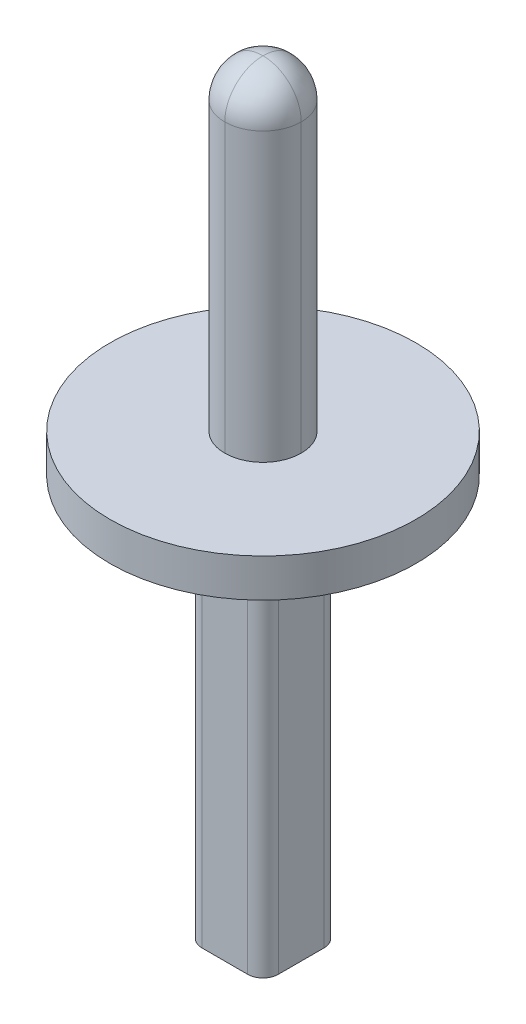
ISO-10303-21;
HEADER;
FILE_DESCRIPTION(('STEP AP214'),'2;1');
FILE_NAME('part.step','',(''),(''),'','','');
FILE_SCHEMA(('AUTOMOTIVE_DESIGN { 1 0 10303 214 1 1 1 1 }'));
ENDSEC;
DATA;
#1=APPLICATION_CONTEXT('core data for automotive mechanical design processes');
#2=APPLICATION_PROTOCOL_DEFINITION('international standard','automotive_design',2000,#1);
#3=PRODUCT_CONTEXT('',#1,'mechanical');
#4=PRODUCT('Part','Part','',(#3));
#5=PRODUCT_RELATED_PRODUCT_CATEGORY('part','',(#4));
#6=PRODUCT_DEFINITION_FORMATION('','',#4);
#7=PRODUCT_DEFINITION_CONTEXT('part definition',#1,'design');
#8=PRODUCT_DEFINITION('design','',#6,#7);
#9=PRODUCT_DEFINITION_SHAPE('','',#8);
#10=(LENGTH_UNIT() NAMED_UNIT(*) SI_UNIT(.MILLI.,.METRE.));
#11=(NAMED_UNIT(*) PLANE_ANGLE_UNIT() SI_UNIT($,.RADIAN.));
#12=(NAMED_UNIT(*) SI_UNIT($,.STERADIAN.) SOLID_ANGLE_UNIT());
#13=UNCERTAINTY_MEASURE_WITH_UNIT(LENGTH_MEASURE(1.E-05),#10,'distance_accuracy_value','');
#14=(GEOMETRIC_REPRESENTATION_CONTEXT(3) GLOBAL_UNCERTAINTY_ASSIGNED_CONTEXT((#13)) GLOBAL_UNIT_ASSIGNED_CONTEXT((#10,
#11,#12)) REPRESENTATION_CONTEXT('',''));
#15=CARTESIAN_POINT('',(0.,0.,0.));
#16=DIRECTION('',(0.,0.,1.));
#17=DIRECTION('',(1.,0.,0.));
#18=AXIS2_PLACEMENT_3D('',#15,#16,#17);
#19=CARTESIAN_POINT('',(0.,11.2295943431093,0.));
#20=DIRECTION('',(0.,1.,0.));
#21=DIRECTION('',(0.,0.,1.));
#22=AXIS2_PLACEMENT_3D('',#19,#20,#21);
#23=PLANE('',#22);
#24=CARTESIAN_POINT('',(0.,11.2295943431093,0.));
#25=DIRECTION('',(0.,1.,0.));
#26=DIRECTION('',(0.,0.,1.));
#27=AXIS2_PLACEMENT_3D('',#24,#25,#26);
#28=CIRCLE('',#27,7.5);
#29=CARTESIAN_POINT('',(-7.5,11.2295943431093,0.));
#30=VERTEX_POINT('',#29);
#31=CARTESIAN_POINT('',(0.,11.2295943431093,-7.5));
#32=VERTEX_POINT('',#31);
#33=EDGE_CURVE('E182',#30,#32,#28,.F.);
#34=ORIENTED_EDGE('',*,*,#33,.T.);
#35=CARTESIAN_POINT('',(0.,11.2295943431093,0.));
#36=DIRECTION('',(0.,1.,0.));
#37=DIRECTION('',(0.,0.,1.));
#38=AXIS2_PLACEMENT_3D('',#35,#36,#37);
#39=CIRCLE('',#38,7.5);
#40=CARTESIAN_POINT('',(7.5,11.2295943431093,0.));
#41=VERTEX_POINT('',#40);
#42=EDGE_CURVE('E166',#32,#41,#39,.F.);
#43=ORIENTED_EDGE('',*,*,#42,.T.);
#44=CARTESIAN_POINT('',(0.,11.2295943431093,0.));
#45=DIRECTION('',(0.,1.,0.));
#46=DIRECTION('',(0.,0.,1.));
#47=AXIS2_PLACEMENT_3D('',#44,#45,#46);
#48=CIRCLE('',#47,7.5);
#49=CARTESIAN_POINT('',(0.,11.2295943431093,7.5));
#50=VERTEX_POINT('',#49);
#51=EDGE_CURVE('E178',#41,#50,#48,.F.);
#52=ORIENTED_EDGE('',*,*,#51,.T.);
#53=CARTESIAN_POINT('',(0.,11.2295943431093,0.));
#54=DIRECTION('',(0.,1.,0.));
#55=DIRECTION('',(0.,0.,1.));
#56=AXIS2_PLACEMENT_3D('',#53,#54,#55);
#57=CIRCLE('',#56,7.5);
#58=EDGE_CURVE('E180',#50,#30,#57,.F.);
#59=ORIENTED_EDGE('',*,*,#58,.T.);
#60=EDGE_LOOP('',(#34,#43,#52,#59));
#61=FACE_BOUND('',#60,.T.);
#62=CARTESIAN_POINT('',(0.,11.2295943431093,0.));
#63=DIRECTION('',(0.,1.,0.));
#64=DIRECTION('',(0.,0.,1.));
#65=AXIS2_PLACEMENT_3D('',#62,#63,#64);
#66=CIRCLE('',#65,30.);
#67=CARTESIAN_POINT('',(0.,11.2295943431093,30.));
#68=VERTEX_POINT('',#67);
#69=EDGE_CURVE('E232',#68,#68,#66,.T.);
#70=ORIENTED_EDGE('',*,*,#69,.T.);
#71=EDGE_LOOP('',(#70));
#72=FACE_BOUND('',#71,.T.);
#73=ADVANCED_FACE('F45',(#61,#72),#23,.T.);
#74=CARTESIAN_POINT('',(0.,3.72959434310934,0.));
#75=DIRECTION('',(0.,1.,0.));
#76=DIRECTION('',(0.,0.,1.));
#77=AXIS2_PLACEMENT_3D('',#74,#75,#76);
#78=PLANE('',#77);
#79=CARTESIAN_POINT('',(0.,3.72959434310934,0.));
#80=DIRECTION('',(0.,1.,0.));
#81=DIRECTION('',(0.,0.,1.));
#82=AXIS2_PLACEMENT_3D('',#79,#80,#81);
#83=CIRCLE('',#82,30.);
#84=CARTESIAN_POINT('',(0.,3.72959434310934,30.));
#85=VERTEX_POINT('',#84);
#86=EDGE_CURVE('E233',#85,#85,#83,.T.);
#87=ORIENTED_EDGE('',*,*,#86,.F.);
#88=EDGE_LOOP('',(#87));
#89=FACE_BOUND('',#88,.T.);
#90=DIRECTION('',(-1.,0.,0.));
#91=VECTOR('',#90,1.);
#92=CARTESIAN_POINT('',(-7.5,3.72959434310934,-7.5));
#93=LINE('',#92,#91);
#94=CARTESIAN_POINT('',(4.5,3.72959434310934,-7.5));
#95=VERTEX_POINT('',#94);
#96=CARTESIAN_POINT('',(-4.5,3.72959434310934,-7.5));
#97=VERTEX_POINT('',#96);
#98=EDGE_CURVE('E236',#95,#97,#93,.T.);
#99=ORIENTED_EDGE('',*,*,#98,.T.);
#100=CARTESIAN_POINT('',(-4.5,3.72959434310933,-4.5));
#101=DIRECTION('',(0.,1.,0.));
#102=DIRECTION('',(0.,0.,1.));
#103=AXIS2_PLACEMENT_3D('',#100,#101,#102);
#104=CIRCLE('',#103,3.);
#105=CARTESIAN_POINT('',(-7.5,3.72959434310934,-4.5));
#106=VERTEX_POINT('',#105);
#107=EDGE_CURVE('E134',#97,#106,#104,.T.);
#108=ORIENTED_EDGE('',*,*,#107,.T.);
#109=DIRECTION('',(0.,0.,1.));
#110=VECTOR('',#109,1.);
#111=CARTESIAN_POINT('',(-7.5,3.72959434310934,-7.5));
#112=LINE('',#111,#110);
#113=CARTESIAN_POINT('',(-7.5,3.72959434310934,4.5));
#114=VERTEX_POINT('',#113);
#115=EDGE_CURVE('E169',#106,#114,#112,.T.);
#116=ORIENTED_EDGE('',*,*,#115,.T.);
#117=CARTESIAN_POINT('',(-4.5,3.72959434310933,4.5));
#118=DIRECTION('',(0.,1.,0.));
#119=DIRECTION('',(0.,0.,1.));
#120=AXIS2_PLACEMENT_3D('',#117,#118,#119);
#121=CIRCLE('',#120,3.);
#122=CARTESIAN_POINT('',(-4.5,3.72959434310934,7.5));
#123=VERTEX_POINT('',#122);
#124=EDGE_CURVE('E187',#114,#123,#121,.T.);
#125=ORIENTED_EDGE('',*,*,#124,.T.);
#126=DIRECTION('',(1.,0.,0.));
#127=VECTOR('',#126,1.);
#128=CARTESIAN_POINT('',(-7.5,3.72959434310934,7.5));
#129=LINE('',#128,#127);
#130=CARTESIAN_POINT('',(4.5,3.72959434310934,7.5));
#131=VERTEX_POINT('',#130);
#132=EDGE_CURVE('E243',#123,#131,#129,.T.);
#133=ORIENTED_EDGE('',*,*,#132,.T.);
#134=CARTESIAN_POINT('',(4.5,3.72959434310933,4.5));
#135=DIRECTION('',(0.,1.,0.));
#136=DIRECTION('',(0.,0.,1.));
#137=AXIS2_PLACEMENT_3D('',#134,#135,#136);
#138=CIRCLE('',#137,3.);
#139=CARTESIAN_POINT('',(7.5,3.72959434310934,4.5));
#140=VERTEX_POINT('',#139);
#141=EDGE_CURVE('E185',#131,#140,#138,.T.);
#142=ORIENTED_EDGE('',*,*,#141,.T.);
#143=DIRECTION('',(0.,0.,-1.));
#144=VECTOR('',#143,1.);
#145=CARTESIAN_POINT('',(7.5,3.72959434310934,-7.5));
#146=LINE('',#145,#144);
#147=CARTESIAN_POINT('',(7.5,3.72959434310934,-4.5));
#148=VERTEX_POINT('',#147);
#149=EDGE_CURVE('E240',#140,#148,#146,.T.);
#150=ORIENTED_EDGE('',*,*,#149,.T.);
#151=CARTESIAN_POINT('',(4.5,3.72959434310933,-4.5));
#152=DIRECTION('',(0.,1.,0.));
#153=DIRECTION('',(0.,0.,1.));
#154=AXIS2_PLACEMENT_3D('',#151,#152,#153);
#155=CIRCLE('',#154,3.);
#156=EDGE_CURVE('E189',#148,#95,#155,.T.);
#157=ORIENTED_EDGE('',*,*,#156,.T.);
#158=EDGE_LOOP('',(#99,#108,#116,#125,#133,#142,#150,#157));
#159=FACE_BOUND('',#158,.T.);
#160=ADVANCED_FACE('F247',(#89,#159),#78,.F.);
#161=CARTESIAN_POINT('',(0.,11.2295943431093,0.));
#162=DIRECTION('',(0.,-1.,0.));
#163=DIRECTION('',(0.,0.,-1.));
#164=AXIS2_PLACEMENT_3D('',#161,#162,#163);
#165=CYLINDRICAL_SURFACE('',#164,30.);
#166=ORIENTED_EDGE('',*,*,#69,.F.);
#167=EDGE_LOOP('',(#166));
#168=FACE_BOUND('',#167,.T.);
#169=ORIENTED_EDGE('',*,*,#86,.T.);
#170=EDGE_LOOP('',(#169));
#171=FACE_BOUND('',#170,.T.);
#172=ADVANCED_FACE('F297',(#168,#171),#165,.T.);
#173=CARTESIAN_POINT('',(0.,-75.0204056568907,0.));
#174=DIRECTION('',(0.,-1.,0.));
#175=DIRECTION('',(0.,0.,-1.));
#176=AXIS2_PLACEMENT_3D('',#173,#174,#175);
#177=PLANE('',#176);
#178=DIRECTION('',(0.,0.,1.));
#179=VECTOR('',#178,1.);
#180=CARTESIAN_POINT('',(-7.5,-75.0204056568907,7.5));
#181=LINE('',#180,#179);
#182=CARTESIAN_POINT('',(-7.5,-75.0204056568907,-4.5));
#183=VERTEX_POINT('',#182);
#184=CARTESIAN_POINT('',(-7.5,-75.0204056568907,4.5));
#185=VERTEX_POINT('',#184);
#186=EDGE_CURVE('E223',#183,#185,#181,.T.);
#187=ORIENTED_EDGE('',*,*,#186,.F.);
#188=CARTESIAN_POINT('',(-4.5,-75.0204056568907,-4.5));
#189=DIRECTION('',(0.,-1.,0.));
#190=DIRECTION('',(0.,0.,-1.));
#191=AXIS2_PLACEMENT_3D('',#188,#189,#190);
#192=CIRCLE('',#191,3.);
#193=CARTESIAN_POINT('',(-4.5,-75.0204056568907,-7.5));
#194=VERTEX_POINT('',#193);
#195=EDGE_CURVE('E207',#183,#194,#192,.T.);
#196=ORIENTED_EDGE('',*,*,#195,.T.);
#197=DIRECTION('',(-1.,0.,0.));
#198=VECTOR('',#197,1.);
#199=CARTESIAN_POINT('',(-7.5,-75.0204056568907,-7.5));
#200=LINE('',#199,#198);
#201=CARTESIAN_POINT('',(4.5,-75.0204056568907,-7.5));
#202=VERTEX_POINT('',#201);
#203=EDGE_CURVE('E226',#202,#194,#200,.T.);
#204=ORIENTED_EDGE('',*,*,#203,.F.);
#205=CARTESIAN_POINT('',(4.5,-75.0204056568907,-4.5));
#206=DIRECTION('',(0.,-1.,0.));
#207=DIRECTION('',(0.,0.,-1.));
#208=AXIS2_PLACEMENT_3D('',#205,#206,#207);
#209=CIRCLE('',#208,3.);
#210=CARTESIAN_POINT('',(7.5,-75.0204056568907,-4.5));
#211=VERTEX_POINT('',#210);
#212=EDGE_CURVE('E209',#202,#211,#209,.T.);
#213=ORIENTED_EDGE('',*,*,#212,.T.);
#214=DIRECTION('',(0.,0.,-1.));
#215=VECTOR('',#214,1.);
#216=CARTESIAN_POINT('',(7.5,-75.0204056568907,7.5));
#217=LINE('',#216,#215);
#218=CARTESIAN_POINT('',(7.5,-75.0204056568907,4.5));
#219=VERTEX_POINT('',#218);
#220=EDGE_CURVE('E229',#219,#211,#217,.T.);
#221=ORIENTED_EDGE('',*,*,#220,.F.);
#222=CARTESIAN_POINT('',(4.5,-75.0204056568907,4.5));
#223=DIRECTION('',(0.,-1.,0.));
#224=DIRECTION('',(0.,0.,-1.));
#225=AXIS2_PLACEMENT_3D('',#222,#223,#224);
#226=CIRCLE('',#225,3.);
#227=CARTESIAN_POINT('',(4.5,-75.0204056568907,7.5));
#228=VERTEX_POINT('',#227);
#229=EDGE_CURVE('E213',#219,#228,#226,.T.);
#230=ORIENTED_EDGE('',*,*,#229,.T.);
#231=DIRECTION('',(1.,0.,0.));
#232=VECTOR('',#231,1.);
#233=CARTESIAN_POINT('',(-7.5,-75.0204056568907,7.5));
#234=LINE('',#233,#232);
#235=CARTESIAN_POINT('',(-4.5,-75.0204056568907,7.5));
#236=VERTEX_POINT('',#235);
#237=EDGE_CURVE('E220',#236,#228,#234,.T.);
#238=ORIENTED_EDGE('',*,*,#237,.F.);
#239=CARTESIAN_POINT('',(-4.5,-75.0204056568907,4.5));
#240=DIRECTION('',(0.,-1.,0.));
#241=DIRECTION('',(0.,0.,-1.));
#242=AXIS2_PLACEMENT_3D('',#239,#240,#241);
#243=CIRCLE('',#242,3.);
#244=EDGE_CURVE('E211',#236,#185,#243,.T.);
#245=ORIENTED_EDGE('',*,*,#244,.T.);
#246=EDGE_LOOP('',(#187,#196,#204,#213,#221,#230,#238,#245));
#247=FACE_BOUND('',#246,.T.);
#248=ADVANCED_FACE('F261',(#247),#177,.T.);
#249=CARTESIAN_POINT('',(-7.5,74.9795943431093,7.5));
#250=DIRECTION('',(0.,0.,-1.));
#251=DIRECTION('',(-1.,0.,0.));
#252=AXIS2_PLACEMENT_3D('',#249,#250,#251);
#253=PLANE('',#252);
#254=ORIENTED_EDGE('',*,*,#132,.F.);
#255=DIRECTION('',(0.,-1.,0.));
#256=VECTOR('',#255,1.);
#257=CARTESIAN_POINT('',(-4.5,74.9795943431093,7.5));
#258=LINE('',#257,#256);
#259=EDGE_CURVE('E192',#123,#236,#258,.T.);
#260=ORIENTED_EDGE('',*,*,#259,.T.);
#261=ORIENTED_EDGE('',*,*,#237,.T.);
#262=DIRECTION('',(0.,-1.,0.));
#263=VECTOR('',#262,1.);
#264=CARTESIAN_POINT('',(4.5,74.9795943431093,7.5));
#265=LINE('',#264,#263);
#266=EDGE_CURVE('E195',#228,#131,#265,.F.);
#267=ORIENTED_EDGE('',*,*,#266,.T.);
#268=EDGE_LOOP('',(#254,#260,#261,#267));
#269=FACE_BOUND('',#268,.T.);
#270=ADVANCED_FACE('F257',(#269),#253,.F.);
#271=CARTESIAN_POINT('',(-7.5,74.9795943431093,7.5));
#272=DIRECTION('',(1.,0.,0.));
#273=DIRECTION('',(0.,0.,-1.));
#274=AXIS2_PLACEMENT_3D('',#271,#272,#273);
#275=PLANE('',#274);
#276=ORIENTED_EDGE('',*,*,#115,.F.);
#277=DIRECTION('',(0.,-1.,0.));
#278=VECTOR('',#277,1.);
#279=CARTESIAN_POINT('',(-7.5,74.9795943431093,-4.5));
#280=LINE('',#279,#278);
#281=EDGE_CURVE('E215',#106,#183,#280,.T.);
#282=ORIENTED_EDGE('',*,*,#281,.T.);
#283=ORIENTED_EDGE('',*,*,#186,.T.);
#284=DIRECTION('',(0.,-1.,0.));
#285=VECTOR('',#284,1.);
#286=CARTESIAN_POINT('',(-7.5,74.9795943431093,4.5));
#287=LINE('',#286,#285);
#288=EDGE_CURVE('E218',#185,#114,#287,.F.);
#289=ORIENTED_EDGE('',*,*,#288,.T.);
#290=EDGE_LOOP('',(#276,#282,#283,#289));
#291=FACE_BOUND('',#290,.T.);
#292=ADVANCED_FACE('F282',(#291),#275,.F.);
#293=CARTESIAN_POINT('',(-7.5,74.9795943431093,-7.5));
#294=DIRECTION('',(0.,0.,1.));
#295=DIRECTION('',(1.,0.,0.));
#296=AXIS2_PLACEMENT_3D('',#293,#294,#295);
#297=PLANE('',#296);
#298=ORIENTED_EDGE('',*,*,#203,.T.);
#299=DIRECTION('',(0.,-1.,0.));
#300=VECTOR('',#299,1.);
#301=CARTESIAN_POINT('',(-4.5,74.9795943431093,-7.5));
#302=LINE('',#301,#300);
#303=EDGE_CURVE('E202',#194,#97,#302,.F.);
#304=ORIENTED_EDGE('',*,*,#303,.T.);
#305=ORIENTED_EDGE('',*,*,#98,.F.);
#306=DIRECTION('',(0.,-1.,0.));
#307=VECTOR('',#306,1.);
#308=CARTESIAN_POINT('',(4.5,74.9795943431093,-7.5));
#309=LINE('',#308,#307);
#310=EDGE_CURVE('E204',#95,#202,#309,.T.);
#311=ORIENTED_EDGE('',*,*,#310,.T.);
#312=EDGE_LOOP('',(#298,#304,#305,#311));
#313=FACE_BOUND('',#312,.T.);
#314=ADVANCED_FACE('F278',(#313),#297,.F.);
#315=CARTESIAN_POINT('',(7.5,74.9795943431093,7.5));
#316=DIRECTION('',(-1.,0.,0.));
#317=DIRECTION('',(0.,0.,1.));
#318=AXIS2_PLACEMENT_3D('',#315,#316,#317);
#319=PLANE('',#318);
#320=ORIENTED_EDGE('',*,*,#220,.T.);
#321=DIRECTION('',(0.,-1.,0.));
#322=VECTOR('',#321,1.);
#323=CARTESIAN_POINT('',(7.5,74.9795943431093,-4.5));
#324=LINE('',#323,#322);
#325=EDGE_CURVE('E197',#211,#148,#324,.F.);
#326=ORIENTED_EDGE('',*,*,#325,.T.);
#327=ORIENTED_EDGE('',*,*,#149,.F.);
#328=DIRECTION('',(0.,-1.,0.));
#329=VECTOR('',#328,1.);
#330=CARTESIAN_POINT('',(7.5,74.9795943431093,4.5));
#331=LINE('',#330,#329);
#332=EDGE_CURVE('E199',#140,#219,#331,.T.);
#333=ORIENTED_EDGE('',*,*,#332,.T.);
#334=EDGE_LOOP('',(#320,#326,#327,#333));
#335=FACE_BOUND('',#334,.T.);
#336=ADVANCED_FACE('F269',(#335),#319,.F.);
#337=CARTESIAN_POINT('',(-4.5,74.9795943431093,-4.5));
#338=DIRECTION('',(0.,-1.,0.));
#339=DIRECTION('',(0.,0.,-1.));
#340=AXIS2_PLACEMENT_3D('',#337,#338,#339);
#341=CYLINDRICAL_SURFACE('',#340,3.);
#342=ORIENTED_EDGE('',*,*,#107,.F.);
#343=ORIENTED_EDGE('',*,*,#303,.F.);
#344=ORIENTED_EDGE('',*,*,#195,.F.);
#345=ORIENTED_EDGE('',*,*,#281,.F.);
#346=EDGE_LOOP('',(#342,#343,#344,#345));
#347=FACE_BOUND('',#346,.T.);
#348=ADVANCED_FACE('F281',(#347),#341,.T.);
#349=CARTESIAN_POINT('',(4.5,74.9795943431093,-4.5));
#350=DIRECTION('',(0.,-1.,0.));
#351=DIRECTION('',(0.,0.,-1.));
#352=AXIS2_PLACEMENT_3D('',#349,#350,#351);
#353=CYLINDRICAL_SURFACE('',#352,3.);
#354=ORIENTED_EDGE('',*,*,#156,.F.);
#355=ORIENTED_EDGE('',*,*,#325,.F.);
#356=ORIENTED_EDGE('',*,*,#212,.F.);
#357=ORIENTED_EDGE('',*,*,#310,.F.);
#358=EDGE_LOOP('',(#354,#355,#356,#357));
#359=FACE_BOUND('',#358,.T.);
#360=ADVANCED_FACE('F275',(#359),#353,.T.);
#361=CARTESIAN_POINT('',(-4.5,74.9795943431093,4.5));
#362=DIRECTION('',(0.,-1.,0.));
#363=DIRECTION('',(0.,0.,-1.));
#364=AXIS2_PLACEMENT_3D('',#361,#362,#363);
#365=CYLINDRICAL_SURFACE('',#364,3.);
#366=ORIENTED_EDGE('',*,*,#124,.F.);
#367=ORIENTED_EDGE('',*,*,#288,.F.);
#368=ORIENTED_EDGE('',*,*,#244,.F.);
#369=ORIENTED_EDGE('',*,*,#259,.F.);
#370=EDGE_LOOP('',(#366,#367,#368,#369));
#371=FACE_BOUND('',#370,.T.);
#372=ADVANCED_FACE('F254',(#371),#365,.T.);
#373=CARTESIAN_POINT('',(4.5,74.9795943431093,4.5));
#374=DIRECTION('',(0.,-1.,0.));
#375=DIRECTION('',(0.,0.,-1.));
#376=AXIS2_PLACEMENT_3D('',#373,#374,#375);
#377=CYLINDRICAL_SURFACE('',#376,3.);
#378=ORIENTED_EDGE('',*,*,#141,.F.);
#379=ORIENTED_EDGE('',*,*,#266,.F.);
#380=ORIENTED_EDGE('',*,*,#229,.F.);
#381=ORIENTED_EDGE('',*,*,#332,.F.);
#382=EDGE_LOOP('',(#378,#379,#380,#381));
#383=FACE_BOUND('',#382,.T.);
#384=ADVANCED_FACE('F266',(#383),#377,.T.);
#385=CARTESIAN_POINT('',(0.,74.9795943431093,0.));
#386=DIRECTION('',(0.,-1.,0.));
#387=DIRECTION('',(0.,0.,-1.));
#388=AXIS2_PLACEMENT_3D('',#385,#386,#387);
#389=CYLINDRICAL_SURFACE('',#388,7.5);
#390=DIRECTION('',(0.,-1.,0.));
#391=VECTOR('',#390,1.);
#392=CARTESIAN_POINT('',(7.5,74.9795943431093,0.));
#393=LINE('',#392,#391);
#394=CARTESIAN_POINT('',(7.5,67.4795943431093,0.));
#395=VERTEX_POINT('',#394);
#396=EDGE_CURVE('E167',#395,#41,#393,.T.);
#397=ORIENTED_EDGE('',*,*,#396,.F.);
#398=CARTESIAN_POINT('',(0.,67.4795943431093,0.));
#399=DIRECTION('',(0.,-1.,0.));
#400=DIRECTION('',(0.,0.,-1.));
#401=AXIS2_PLACEMENT_3D('',#398,#399,#400);
#402=CIRCLE('',#401,7.5);
#403=CARTESIAN_POINT('',(0.,67.4795943431093,7.5));
#404=VERTEX_POINT('',#403);
#405=EDGE_CURVE('E160',#395,#404,#402,.T.);
#406=ORIENTED_EDGE('',*,*,#405,.T.);
#407=DIRECTION('',(0.,-1.,0.));
#408=VECTOR('',#407,1.);
#409=CARTESIAN_POINT('',(0.,74.9795943431093,7.5));
#410=LINE('',#409,#408);
#411=EDGE_CURVE('E170',#50,#404,#410,.F.);
#412=ORIENTED_EDGE('',*,*,#411,.F.);
#413=ORIENTED_EDGE('',*,*,#51,.F.);
#414=EDGE_LOOP('',(#397,#406,#412,#413));
#415=FACE_BOUND('',#414,.T.);
#416=ADVANCED_FACE('F372',(#415),#389,.T.);
#417=CARTESIAN_POINT('',(0.,74.9795943431093,0.));
#418=DIRECTION('',(0.,-1.,0.));
#419=DIRECTION('',(0.,0.,-1.));
#420=AXIS2_PLACEMENT_3D('',#417,#418,#419);
#421=CYLINDRICAL_SURFACE('',#420,7.5);
#422=DIRECTION('',(0.,-1.,0.));
#423=VECTOR('',#422,1.);
#424=CARTESIAN_POINT('',(0.,74.9795943431093,-7.5));
#425=LINE('',#424,#423);
#426=CARTESIAN_POINT('',(0.,67.4795943431093,-7.5));
#427=VERTEX_POINT('',#426);
#428=EDGE_CURVE('E173',#427,#32,#425,.T.);
#429=ORIENTED_EDGE('',*,*,#428,.F.);
#430=CARTESIAN_POINT('',(0.,67.4795943431093,0.));
#431=DIRECTION('',(0.,-1.,0.));
#432=DIRECTION('',(0.,0.,-1.));
#433=AXIS2_PLACEMENT_3D('',#430,#431,#432);
#434=CIRCLE('',#433,7.5);
#435=EDGE_CURVE('E12',#427,#395,#434,.T.);
#436=ORIENTED_EDGE('',*,*,#435,.T.);
#437=ORIENTED_EDGE('',*,*,#396,.T.);
#438=ORIENTED_EDGE('',*,*,#42,.F.);
#439=EDGE_LOOP('',(#429,#436,#437,#438));
#440=FACE_BOUND('',#439,.T.);
#441=ADVANCED_FACE('F380',(#440),#421,.T.);
#442=CARTESIAN_POINT('',(0.,74.9795943431093,0.));
#443=DIRECTION('',(0.,-1.,0.));
#444=DIRECTION('',(0.,0.,-1.));
#445=AXIS2_PLACEMENT_3D('',#442,#443,#444);
#446=CYLINDRICAL_SURFACE('',#445,7.5);
#447=ORIENTED_EDGE('',*,*,#411,.T.);
#448=CARTESIAN_POINT('',(0.,67.4795943431093,0.));
#449=DIRECTION('',(0.,-1.,0.));
#450=DIRECTION('',(0.,0.,-1.));
#451=AXIS2_PLACEMENT_3D('',#448,#449,#450);
#452=CIRCLE('',#451,7.5);
#453=CARTESIAN_POINT('',(-7.5,67.4795943431093,0.));
#454=VERTEX_POINT('',#453);
#455=EDGE_CURVE('E154',#404,#454,#452,.T.);
#456=ORIENTED_EDGE('',*,*,#455,.T.);
#457=DIRECTION('',(0.,-1.,0.));
#458=VECTOR('',#457,1.);
#459=CARTESIAN_POINT('',(-7.5,74.9795943431093,0.));
#460=LINE('',#459,#458);
#461=EDGE_CURVE('E146',#30,#454,#460,.F.);
#462=ORIENTED_EDGE('',*,*,#461,.F.);
#463=ORIENTED_EDGE('',*,*,#58,.F.);
#464=EDGE_LOOP('',(#447,#456,#462,#463));
#465=FACE_BOUND('',#464,.T.);
#466=ADVANCED_FACE('F389',(#465),#446,.T.);
#467=CARTESIAN_POINT('',(0.,74.9795943431093,0.));
#468=DIRECTION('',(0.,-1.,0.));
#469=DIRECTION('',(0.,0.,-1.));
#470=AXIS2_PLACEMENT_3D('',#467,#468,#469);
#471=CYLINDRICAL_SURFACE('',#470,7.5);
#472=ORIENTED_EDGE('',*,*,#461,.T.);
#473=CARTESIAN_POINT('',(0.,67.4795943431093,0.));
#474=DIRECTION('',(0.,-1.,0.));
#475=DIRECTION('',(0.,0.,-1.));
#476=AXIS2_PLACEMENT_3D('',#473,#474,#475);
#477=CIRCLE('',#476,7.5);
#478=EDGE_CURVE('E55',#454,#427,#477,.T.);
#479=ORIENTED_EDGE('',*,*,#478,.T.);
#480=ORIENTED_EDGE('',*,*,#428,.T.);
#481=ORIENTED_EDGE('',*,*,#33,.F.);
#482=EDGE_LOOP('',(#472,#479,#480,#481));
#483=FACE_BOUND('',#482,.T.);
#484=ADVANCED_FACE('F398',(#483),#471,.T.);
#485=CARTESIAN_POINT('',(0.,67.4795943431093,0.));
#486=DIRECTION('',(0.,-1.,0.));
#487=DIRECTION('',(0.,0.,-1.));
#488=AXIS2_PLACEMENT_3D('',#485,#486,#487);
#489=SPHERICAL_SURFACE('',#488,7.5);
#490=CARTESIAN_POINT('',(0.,67.4795943431093,0.));
#491=DIRECTION('',(1.,0.,0.));
#492=DIRECTION('',(0.,0.,-1.));
#493=AXIS2_PLACEMENT_3D('',#490,#491,#492);
#494=CIRCLE('',#493,7.5);
#495=CARTESIAN_POINT('',(0.,74.9795943431093,0.));
#496=VERTEX_POINT('',#495);
#497=EDGE_CURVE('E141',#427,#496,#494,.T.);
#498=ORIENTED_EDGE('',*,*,#497,.F.);
#499=ORIENTED_EDGE('',*,*,#478,.F.);
#500=CARTESIAN_POINT('',(0.,67.4795943431093,0.));
#501=DIRECTION('',(0.,0.,1.));
#502=DIRECTION('',(1.,0.,0.));
#503=AXIS2_PLACEMENT_3D('',#500,#501,#502);
#504=CIRCLE('',#503,7.5);
#505=EDGE_CURVE('E49',#496,#454,#504,.T.);
#506=ORIENTED_EDGE('',*,*,#505,.F.);
#507=EDGE_LOOP('',(#498,#499,#506));
#508=FACE_BOUND('',#507,.T.);
#509=ADVANCED_FACE('F47',(#508),#489,.T.);
#510=CARTESIAN_POINT('',(0.,67.4795943431093,0.));
#511=DIRECTION('',(0.,-1.,0.));
#512=DIRECTION('',(0.,0.,-1.));
#513=AXIS2_PLACEMENT_3D('',#510,#511,#512);
#514=SPHERICAL_SURFACE('',#513,7.5);
#515=ORIENTED_EDGE('',*,*,#505,.T.);
#516=ORIENTED_EDGE('',*,*,#455,.F.);
#517=CARTESIAN_POINT('',(0.,67.4795943431093,0.));
#518=DIRECTION('',(1.,0.,0.));
#519=DIRECTION('',(0.,0.,-1.));
#520=AXIS2_PLACEMENT_3D('',#517,#518,#519);
#521=CIRCLE('',#520,7.5);
#522=EDGE_CURVE('E152',#496,#404,#521,.T.);
#523=ORIENTED_EDGE('',*,*,#522,.F.);
#524=EDGE_LOOP('',(#515,#516,#523));
#525=FACE_BOUND('',#524,.T.);
#526=ADVANCED_FACE('F153',(#525),#514,.T.);
#527=CARTESIAN_POINT('',(0.,67.4795943431093,0.));
#528=DIRECTION('',(0.,-1.,0.));
#529=DIRECTION('',(0.,0.,-1.));
#530=AXIS2_PLACEMENT_3D('',#527,#528,#529);
#531=SPHERICAL_SURFACE('',#530,7.5);
#532=ORIENTED_EDGE('',*,*,#435,.F.);
#533=ORIENTED_EDGE('',*,*,#497,.T.);
#534=CARTESIAN_POINT('',(0.,67.4795943431093,0.));
#535=DIRECTION('',(0.,0.,1.));
#536=DIRECTION('',(1.,0.,0.));
#537=AXIS2_PLACEMENT_3D('',#534,#535,#536);
#538=CIRCLE('',#537,7.5);
#539=EDGE_CURVE('E151',#395,#496,#538,.T.);
#540=ORIENTED_EDGE('',*,*,#539,.F.);
#541=EDGE_LOOP('',(#532,#533,#540));
#542=FACE_BOUND('',#541,.T.);
#543=ADVANCED_FACE('F149',(#542),#531,.T.);
#544=CARTESIAN_POINT('',(0.,67.4795943431093,0.));
#545=DIRECTION('',(0.,-1.,0.));
#546=DIRECTION('',(0.,0.,-1.));
#547=AXIS2_PLACEMENT_3D('',#544,#545,#546);
#548=SPHERICAL_SURFACE('',#547,7.5);
#549=ORIENTED_EDGE('',*,*,#522,.T.);
#550=ORIENTED_EDGE('',*,*,#405,.F.);
#551=ORIENTED_EDGE('',*,*,#539,.T.);
#552=EDGE_LOOP('',(#549,#550,#551));
#553=FACE_BOUND('',#552,.T.);
#554=ADVANCED_FACE('F159',(#553),#548,.T.);
#555=CLOSED_SHELL('',(#73,#160,#172,#248,#270,#292,#314,#336,#348,#360,#372,#384,#416,#441,#466,
#484,#509,#526,#543,#554));
#556=MANIFOLD_SOLID_BREP('B2',#555);
#557=ADVANCED_BREP_SHAPE_REPRESENTATION('',(#18,#556),#14);
#558=SHAPE_DEFINITION_REPRESENTATION(#9,#557);
ENDSEC;
END-ISO-10303-21;
